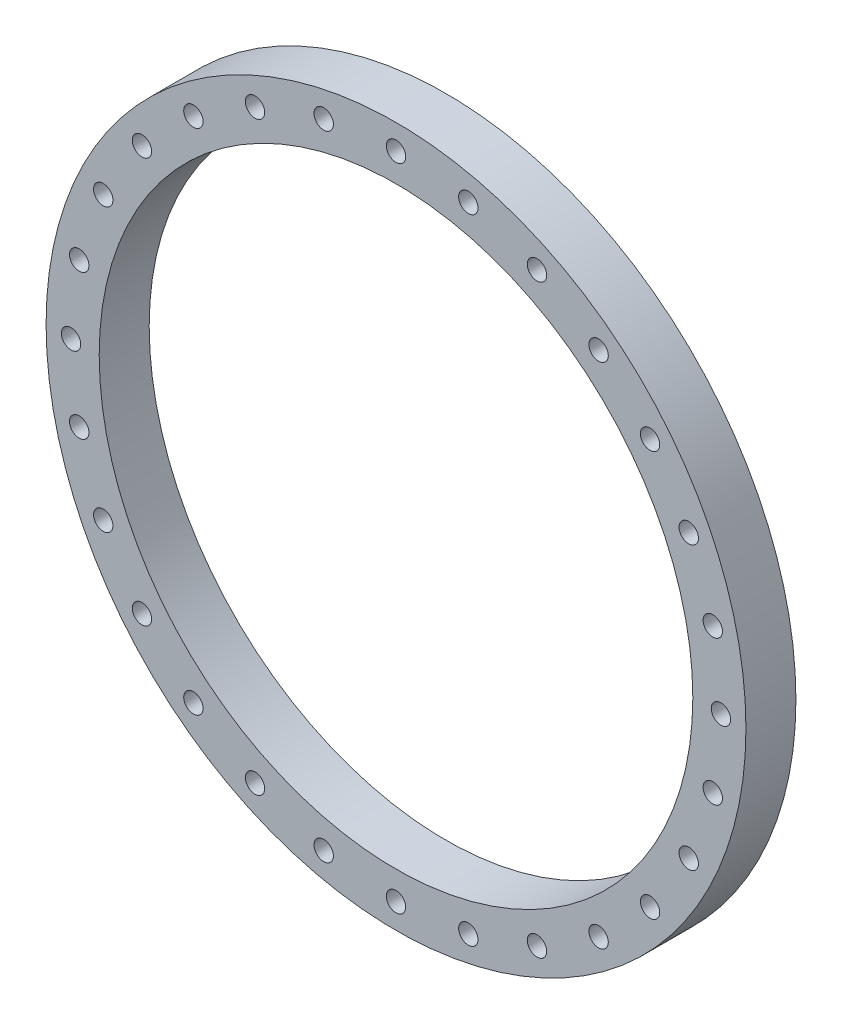
ISO-10303-21;
HEADER;
FILE_DESCRIPTION(('STEP AP214'),'2;1');
FILE_NAME('part.step','',(''),(''),'','','');
FILE_SCHEMA(('AUTOMOTIVE_DESIGN { 1 0 10303 214 1 1 1 1 }'));
ENDSEC;
DATA;
#1=APPLICATION_CONTEXT('core data for automotive mechanical design processes');
#2=APPLICATION_PROTOCOL_DEFINITION('international standard','automotive_design',2000,#1);
#3=PRODUCT_CONTEXT('',#1,'mechanical');
#4=PRODUCT('Part','Part','',(#3));
#5=PRODUCT_RELATED_PRODUCT_CATEGORY('part','',(#4));
#6=PRODUCT_DEFINITION_FORMATION('','',#4);
#7=PRODUCT_DEFINITION_CONTEXT('part definition',#1,'design');
#8=PRODUCT_DEFINITION('design','',#6,#7);
#9=PRODUCT_DEFINITION_SHAPE('','',#8);
#10=(LENGTH_UNIT() NAMED_UNIT(*) SI_UNIT(.MILLI.,.METRE.));
#11=(NAMED_UNIT(*) PLANE_ANGLE_UNIT() SI_UNIT($,.RADIAN.));
#12=(NAMED_UNIT(*) SI_UNIT($,.STERADIAN.) SOLID_ANGLE_UNIT());
#13=UNCERTAINTY_MEASURE_WITH_UNIT(LENGTH_MEASURE(1.E-05),#10,'distance_accuracy_value','');
#14=(GEOMETRIC_REPRESENTATION_CONTEXT(3) GLOBAL_UNCERTAINTY_ASSIGNED_CONTEXT((#13)) GLOBAL_UNIT_ASSIGNED_CONTEXT((#10,
#11,#12)) REPRESENTATION_CONTEXT('',''));
#15=CARTESIAN_POINT('',(0.,0.,0.));
#16=DIRECTION('',(0.,0.,1.));
#17=DIRECTION('',(1.,0.,0.));
#18=AXIS2_PLACEMENT_3D('',#15,#16,#17);
#19=CARTESIAN_POINT('',(0.,0.,8.));
#20=DIRECTION('',(0.,0.,1.));
#21=DIRECTION('',(1.,0.,0.));
#22=AXIS2_PLACEMENT_3D('',#19,#20,#21);
#23=PLANE('',#22);
#24=CARTESIAN_POINT('',(-22.561954434113,46.8503811309258,8.));
#25=DIRECTION('',(0.,0.,1.));
#26=DIRECTION('',(1.,0.,0.));
#27=AXIS2_PLACEMENT_3D('',#24,#25,#26);
#28=CIRCLE('',#27,1.55);
#29=CARTESIAN_POINT('',(-21.011954434113,46.8503811309258,8.));
#30=VERTEX_POINT('',#29);
#31=EDGE_CURVE('E264',#30,#30,#28,.T.);
#32=ORIENTED_EDGE('',*,*,#31,.F.);
#33=EDGE_LOOP('',(#32));
#34=FACE_BOUND('',#33,.T.);
#35=CARTESIAN_POINT('',(-40.6552370883376,32.4214696966541,8.));
#36=DIRECTION('',(0.,0.,1.));
#37=DIRECTION('',(1.,0.,0.));
#38=AXIS2_PLACEMENT_3D('',#35,#36,#37);
#39=CIRCLE('',#38,1.55);
#40=CARTESIAN_POINT('',(-39.1052370883376,32.4214696966541,8.));
#41=VERTEX_POINT('',#40);
#42=EDGE_CURVE('E248',#41,#41,#39,.T.);
#43=ORIENTED_EDGE('',*,*,#42,.F.);
#44=EDGE_LOOP('',(#43));
#45=FACE_BOUND('',#44,.T.);
#46=CARTESIAN_POINT('',(-50.6962514334548,11.5710885657283,8.));
#47=DIRECTION('',(0.,0.,1.));
#48=DIRECTION('',(1.,0.,0.));
#49=AXIS2_PLACEMENT_3D('',#46,#47,#48);
#50=CIRCLE('',#49,1.55);
#51=CARTESIAN_POINT('',(-49.1462514334548,11.5710885657283,8.));
#52=VERTEX_POINT('',#51);
#53=EDGE_CURVE('E232',#52,#52,#50,.T.);
#54=ORIENTED_EDGE('',*,*,#53,.F.);
#55=EDGE_LOOP('',(#54));
#56=FACE_BOUND('',#55,.T.);
#57=CARTESIAN_POINT('',(-50.6962514334548,-11.5710885657284,8.));
#58=DIRECTION('',(0.,0.,1.));
#59=DIRECTION('',(1.,0.,0.));
#60=AXIS2_PLACEMENT_3D('',#57,#58,#59);
#61=CIRCLE('',#60,1.55);
#62=CARTESIAN_POINT('',(-49.1462514334548,-11.5710885657284,8.));
#63=VERTEX_POINT('',#62);
#64=EDGE_CURVE('E216',#63,#63,#61,.T.);
#65=ORIENTED_EDGE('',*,*,#64,.F.);
#66=EDGE_LOOP('',(#65));
#67=FACE_BOUND('',#66,.T.);
#68=CARTESIAN_POINT('',(-40.6552370883375,-32.4214696966541,8.));
#69=DIRECTION('',(0.,0.,1.));
#70=DIRECTION('',(1.,0.,0.));
#71=AXIS2_PLACEMENT_3D('',#68,#69,#70);
#72=CIRCLE('',#71,1.54999999999999);
#73=CARTESIAN_POINT('',(-39.1052370883375,-32.4214696966541,8.));
#74=VERTEX_POINT('',#73);
#75=EDGE_CURVE('E200',#74,#74,#72,.T.);
#76=ORIENTED_EDGE('',*,*,#75,.F.);
#77=EDGE_LOOP('',(#76));
#78=FACE_BOUND('',#77,.T.);
#79=CARTESIAN_POINT('',(-22.561954434113,-46.8503811309258,8.));
#80=DIRECTION('',(0.,0.,1.));
#81=DIRECTION('',(1.,0.,0.));
#82=AXIS2_PLACEMENT_3D('',#79,#80,#81);
#83=CIRCLE('',#82,1.55);
#84=CARTESIAN_POINT('',(-21.011954434113,-46.8503811309258,8.));
#85=VERTEX_POINT('',#84);
#86=EDGE_CURVE('E184',#85,#85,#83,.T.);
#87=ORIENTED_EDGE('',*,*,#86,.F.);
#88=EDGE_LOOP('',(#87));
#89=FACE_BOUND('',#88,.T.);
#90=CARTESIAN_POINT('',(0.,-52.,8.));
#91=DIRECTION('',(0.,0.,1.));
#92=DIRECTION('',(1.,0.,0.));
#93=AXIS2_PLACEMENT_3D('',#90,#91,#92);
#94=CIRCLE('',#93,1.55);
#95=CARTESIAN_POINT('',(1.55000000000001,-52.,8.));
#96=VERTEX_POINT('',#95);
#97=EDGE_CURVE('E168',#96,#96,#94,.T.);
#98=ORIENTED_EDGE('',*,*,#97,.F.);
#99=EDGE_LOOP('',(#98));
#100=FACE_BOUND('',#99,.T.);
#101=CARTESIAN_POINT('',(22.561954434113,-46.8503811309258,8.));
#102=DIRECTION('',(0.,0.,1.));
#103=DIRECTION('',(1.,0.,0.));
#104=AXIS2_PLACEMENT_3D('',#101,#102,#103);
#105=CIRCLE('',#104,1.54999999999999);
#106=CARTESIAN_POINT('',(24.111954434113,-46.8503811309258,8.));
#107=VERTEX_POINT('',#106);
#108=EDGE_CURVE('E152',#107,#107,#105,.T.);
#109=ORIENTED_EDGE('',*,*,#108,.F.);
#110=EDGE_LOOP('',(#109));
#111=FACE_BOUND('',#110,.T.);
#112=CARTESIAN_POINT('',(40.6552370883376,-32.4214696966541,8.));
#113=DIRECTION('',(0.,0.,1.));
#114=DIRECTION('',(1.,0.,0.));
#115=AXIS2_PLACEMENT_3D('',#112,#113,#114);
#116=CIRCLE('',#115,1.55);
#117=CARTESIAN_POINT('',(42.2052370883376,-32.4214696966541,8.));
#118=VERTEX_POINT('',#117);
#119=EDGE_CURVE('E136',#118,#118,#116,.T.);
#120=ORIENTED_EDGE('',*,*,#119,.F.);
#121=EDGE_LOOP('',(#120));
#122=FACE_BOUND('',#121,.T.);
#123=CARTESIAN_POINT('',(50.6962514334548,-11.5710885657283,8.));
#124=DIRECTION('',(0.,0.,1.));
#125=DIRECTION('',(1.,0.,0.));
#126=AXIS2_PLACEMENT_3D('',#123,#124,#125);
#127=CIRCLE('',#126,1.54999999999999);
#128=CARTESIAN_POINT('',(52.2462514334548,-11.5710885657283,8.));
#129=VERTEX_POINT('',#128);
#130=EDGE_CURVE('E120',#129,#129,#127,.T.);
#131=ORIENTED_EDGE('',*,*,#130,.F.);
#132=EDGE_LOOP('',(#131));
#133=FACE_BOUND('',#132,.T.);
#134=CARTESIAN_POINT('',(50.6962514334548,11.5710885657283,8.));
#135=DIRECTION('',(0.,0.,1.));
#136=DIRECTION('',(1.,0.,0.));
#137=AXIS2_PLACEMENT_3D('',#134,#135,#136);
#138=CIRCLE('',#137,1.55);
#139=CARTESIAN_POINT('',(52.2462514334548,11.5710885657283,8.));
#140=VERTEX_POINT('',#139);
#141=EDGE_CURVE('E104',#140,#140,#138,.T.);
#142=ORIENTED_EDGE('',*,*,#141,.F.);
#143=EDGE_LOOP('',(#142));
#144=FACE_BOUND('',#143,.T.);
#145=CARTESIAN_POINT('',(40.6552370883376,32.4214696966541,8.));
#146=DIRECTION('',(0.,0.,1.));
#147=DIRECTION('',(1.,0.,0.));
#148=AXIS2_PLACEMENT_3D('',#145,#146,#147);
#149=CIRCLE('',#148,1.54999999999999);
#150=CARTESIAN_POINT('',(42.2052370883375,32.4214696966541,8.));
#151=VERTEX_POINT('',#150);
#152=EDGE_CURVE('E88',#151,#151,#149,.T.);
#153=ORIENTED_EDGE('',*,*,#152,.F.);
#154=EDGE_LOOP('',(#153));
#155=FACE_BOUND('',#154,.T.);
#156=CARTESIAN_POINT('',(22.561954434113,46.8503811309258,8.));
#157=DIRECTION('',(0.,0.,1.));
#158=DIRECTION('',(1.,0.,0.));
#159=AXIS2_PLACEMENT_3D('',#156,#157,#158);
#160=CIRCLE('',#159,1.55);
#161=CARTESIAN_POINT('',(24.111954434113,46.8503811309258,8.));
#162=VERTEX_POINT('',#161);
#163=EDGE_CURVE('E72',#162,#162,#160,.T.);
#164=ORIENTED_EDGE('',*,*,#163,.F.);
#165=EDGE_LOOP('',(#164));
#166=FACE_BOUND('',#165,.T.);
#167=CARTESIAN_POINT('',(0.,52.,8.));
#168=DIRECTION('',(0.,0.,1.));
#169=DIRECTION('',(1.,0.,0.));
#170=AXIS2_PLACEMENT_3D('',#167,#168,#169);
#171=CIRCLE('',#170,1.55);
#172=CARTESIAN_POINT('',(1.55,52.,8.));
#173=VERTEX_POINT('',#172);
#174=EDGE_CURVE('E56',#173,#173,#171,.T.);
#175=ORIENTED_EDGE('',*,*,#174,.F.);
#176=EDGE_LOOP('',(#175));
#177=FACE_BOUND('',#176,.T.);
#178=CARTESIAN_POINT('',(0.,0.,8.));
#179=DIRECTION('',(0.,0.,1.));
#180=DIRECTION('',(1.,0.,0.));
#181=AXIS2_PLACEMENT_3D('',#178,#179,#180);
#182=CIRCLE('',#181,56.);
#183=CARTESIAN_POINT('',(56.,0.,8.));
#184=VERTEX_POINT('',#183);
#185=EDGE_CURVE('E10',#184,#184,#182,.T.);
#186=ORIENTED_EDGE('',*,*,#185,.T.);
#187=EDGE_LOOP('',(#186));
#188=FACE_BOUND('',#187,.T.);
#189=CARTESIAN_POINT('',(0.,0.,8.));
#190=DIRECTION('',(0.,0.,1.));
#191=DIRECTION('',(1.,0.,0.));
#192=AXIS2_PLACEMENT_3D('',#189,#190,#191);
#193=CIRCLE('',#192,47.5);
#194=CARTESIAN_POINT('',(47.5,0.,8.));
#195=VERTEX_POINT('',#194);
#196=EDGE_CURVE('E50',#195,#195,#193,.T.);
#197=ORIENTED_EDGE('',*,*,#196,.F.);
#198=EDGE_LOOP('',(#197));
#199=FACE_BOUND('',#198,.T.);
#200=CARTESIAN_POINT('',(11.5710885657283,50.6962514334548,8.));
#201=DIRECTION('',(0.,0.,1.));
#202=DIRECTION('',(1.,0.,0.));
#203=AXIS2_PLACEMENT_3D('',#200,#201,#202);
#204=CIRCLE('',#203,1.55);
#205=CARTESIAN_POINT('',(13.1210885657283,50.6962514334548,8.));
#206=VERTEX_POINT('',#205);
#207=EDGE_CURVE('E64',#206,#206,#204,.T.);
#208=ORIENTED_EDGE('',*,*,#207,.F.);
#209=EDGE_LOOP('',(#208));
#210=FACE_BOUND('',#209,.T.);
#211=CARTESIAN_POINT('',(32.4214696966541,40.6552370883376,8.));
#212=DIRECTION('',(0.,0.,1.));
#213=DIRECTION('',(1.,0.,0.));
#214=AXIS2_PLACEMENT_3D('',#211,#212,#213);
#215=CIRCLE('',#214,1.54999999999999);
#216=CARTESIAN_POINT('',(33.9714696966541,40.6552370883376,8.));
#217=VERTEX_POINT('',#216);
#218=EDGE_CURVE('E80',#217,#217,#215,.T.);
#219=ORIENTED_EDGE('',*,*,#218,.F.);
#220=EDGE_LOOP('',(#219));
#221=FACE_BOUND('',#220,.T.);
#222=CARTESIAN_POINT('',(46.8503811309258,22.561954434113,8.));
#223=DIRECTION('',(0.,0.,1.));
#224=DIRECTION('',(1.,0.,0.));
#225=AXIS2_PLACEMENT_3D('',#222,#223,#224);
#226=CIRCLE('',#225,1.55);
#227=CARTESIAN_POINT('',(48.4003811309258,22.561954434113,8.));
#228=VERTEX_POINT('',#227);
#229=EDGE_CURVE('E96',#228,#228,#226,.T.);
#230=ORIENTED_EDGE('',*,*,#229,.F.);
#231=EDGE_LOOP('',(#230));
#232=FACE_BOUND('',#231,.T.);
#233=CARTESIAN_POINT('',(52.,0.,8.));
#234=DIRECTION('',(0.,0.,1.));
#235=DIRECTION('',(1.,0.,0.));
#236=AXIS2_PLACEMENT_3D('',#233,#234,#235);
#237=CIRCLE('',#236,1.54999999999999);
#238=CARTESIAN_POINT('',(53.55,0.,8.));
#239=VERTEX_POINT('',#238);
#240=EDGE_CURVE('E112',#239,#239,#237,.T.);
#241=ORIENTED_EDGE('',*,*,#240,.F.);
#242=EDGE_LOOP('',(#241));
#243=FACE_BOUND('',#242,.T.);
#244=CARTESIAN_POINT('',(46.8503811309258,-22.561954434113,8.));
#245=DIRECTION('',(0.,0.,1.));
#246=DIRECTION('',(1.,0.,0.));
#247=AXIS2_PLACEMENT_3D('',#244,#245,#246);
#248=CIRCLE('',#247,1.54999999999999);
#249=CARTESIAN_POINT('',(48.4003811309258,-22.561954434113,8.));
#250=VERTEX_POINT('',#249);
#251=EDGE_CURVE('E128',#250,#250,#248,.T.);
#252=ORIENTED_EDGE('',*,*,#251,.F.);
#253=EDGE_LOOP('',(#252));
#254=FACE_BOUND('',#253,.T.);
#255=CARTESIAN_POINT('',(32.4214696966541,-40.6552370883375,8.));
#256=DIRECTION('',(0.,0.,1.));
#257=DIRECTION('',(1.,0.,0.));
#258=AXIS2_PLACEMENT_3D('',#255,#256,#257);
#259=CIRCLE('',#258,1.54999999999999);
#260=CARTESIAN_POINT('',(33.9714696966541,-40.6552370883375,8.));
#261=VERTEX_POINT('',#260);
#262=EDGE_CURVE('E144',#261,#261,#259,.T.);
#263=ORIENTED_EDGE('',*,*,#262,.F.);
#264=EDGE_LOOP('',(#263));
#265=FACE_BOUND('',#264,.T.);
#266=CARTESIAN_POINT('',(11.5710885657284,-50.6962514334548,8.));
#267=DIRECTION('',(0.,0.,1.));
#268=DIRECTION('',(1.,0.,0.));
#269=AXIS2_PLACEMENT_3D('',#266,#267,#268);
#270=CIRCLE('',#269,1.55);
#271=CARTESIAN_POINT('',(13.1210885657284,-50.6962514334548,8.));
#272=VERTEX_POINT('',#271);
#273=EDGE_CURVE('E160',#272,#272,#270,.T.);
#274=ORIENTED_EDGE('',*,*,#273,.F.);
#275=EDGE_LOOP('',(#274));
#276=FACE_BOUND('',#275,.T.);
#277=CARTESIAN_POINT('',(-11.5710885657283,-50.6962514334548,8.));
#278=DIRECTION('',(0.,0.,1.));
#279=DIRECTION('',(1.,0.,0.));
#280=AXIS2_PLACEMENT_3D('',#277,#278,#279);
#281=CIRCLE('',#280,1.55);
#282=CARTESIAN_POINT('',(-10.0210885657283,-50.6962514334548,8.));
#283=VERTEX_POINT('',#282);
#284=EDGE_CURVE('E176',#283,#283,#281,.T.);
#285=ORIENTED_EDGE('',*,*,#284,.F.);
#286=EDGE_LOOP('',(#285));
#287=FACE_BOUND('',#286,.T.);
#288=CARTESIAN_POINT('',(-32.4214696966541,-40.6552370883376,8.));
#289=DIRECTION('',(0.,0.,1.));
#290=DIRECTION('',(1.,0.,0.));
#291=AXIS2_PLACEMENT_3D('',#288,#289,#290);
#292=CIRCLE('',#291,1.55);
#293=CARTESIAN_POINT('',(-30.8714696966541,-40.6552370883376,8.));
#294=VERTEX_POINT('',#293);
#295=EDGE_CURVE('E192',#294,#294,#292,.T.);
#296=ORIENTED_EDGE('',*,*,#295,.F.);
#297=EDGE_LOOP('',(#296));
#298=FACE_BOUND('',#297,.T.);
#299=CARTESIAN_POINT('',(-46.8503811309258,-22.561954434113,8.));
#300=DIRECTION('',(0.,0.,1.));
#301=DIRECTION('',(1.,0.,0.));
#302=AXIS2_PLACEMENT_3D('',#299,#300,#301);
#303=CIRCLE('',#302,1.55);
#304=CARTESIAN_POINT('',(-45.3003811309258,-22.561954434113,8.));
#305=VERTEX_POINT('',#304);
#306=EDGE_CURVE('E208',#305,#305,#303,.T.);
#307=ORIENTED_EDGE('',*,*,#306,.F.);
#308=EDGE_LOOP('',(#307));
#309=FACE_BOUND('',#308,.T.);
#310=CARTESIAN_POINT('',(-52.,0.,8.));
#311=DIRECTION('',(0.,0.,1.));
#312=DIRECTION('',(1.,0.,0.));
#313=AXIS2_PLACEMENT_3D('',#310,#311,#312);
#314=CIRCLE('',#313,1.55);
#315=CARTESIAN_POINT('',(-50.45,0.,8.));
#316=VERTEX_POINT('',#315);
#317=EDGE_CURVE('E224',#316,#316,#314,.T.);
#318=ORIENTED_EDGE('',*,*,#317,.F.);
#319=EDGE_LOOP('',(#318));
#320=FACE_BOUND('',#319,.T.);
#321=CARTESIAN_POINT('',(-46.8503811309258,22.561954434113,8.));
#322=DIRECTION('',(0.,0.,1.));
#323=DIRECTION('',(1.,0.,0.));
#324=AXIS2_PLACEMENT_3D('',#321,#322,#323);
#325=CIRCLE('',#324,1.55);
#326=CARTESIAN_POINT('',(-45.3003811309258,22.561954434113,8.));
#327=VERTEX_POINT('',#326);
#328=EDGE_CURVE('E240',#327,#327,#325,.T.);
#329=ORIENTED_EDGE('',*,*,#328,.F.);
#330=EDGE_LOOP('',(#329));
#331=FACE_BOUND('',#330,.T.);
#332=CARTESIAN_POINT('',(-32.4214696966541,40.6552370883375,8.));
#333=DIRECTION('',(0.,0.,1.));
#334=DIRECTION('',(1.,0.,0.));
#335=AXIS2_PLACEMENT_3D('',#332,#333,#334);
#336=CIRCLE('',#335,1.55);
#337=CARTESIAN_POINT('',(-30.8714696966541,40.6552370883375,8.));
#338=VERTEX_POINT('',#337);
#339=EDGE_CURVE('E256',#338,#338,#336,.T.);
#340=ORIENTED_EDGE('',*,*,#339,.F.);
#341=EDGE_LOOP('',(#340));
#342=FACE_BOUND('',#341,.T.);
#343=CARTESIAN_POINT('',(-11.5710885657284,50.6962514334548,8.));
#344=DIRECTION('',(0.,0.,1.));
#345=DIRECTION('',(1.,0.,0.));
#346=AXIS2_PLACEMENT_3D('',#343,#344,#345);
#347=CIRCLE('',#346,1.55);
#348=CARTESIAN_POINT('',(-10.0210885657284,50.6962514334548,8.));
#349=VERTEX_POINT('',#348);
#350=EDGE_CURVE('E272',#349,#349,#347,.T.);
#351=ORIENTED_EDGE('',*,*,#350,.F.);
#352=EDGE_LOOP('',(#351));
#353=FACE_BOUND('',#352,.T.);
#354=ADVANCED_FACE('F37',(#34,#45,#56,#67,#78,#89,#100,#111,#122,#133,#144,#155,#166,#177,#188,
#199,#210,#221,#232,#243,#254,#265,#276,#287,#298,#309,#320,#331,#342,#353),#23,.T.);
#355=CARTESIAN_POINT('',(0.,0.,0.));
#356=DIRECTION('',(0.,0.,1.));
#357=DIRECTION('',(1.,0.,0.));
#358=AXIS2_PLACEMENT_3D('',#355,#356,#357);
#359=PLANE('',#358);
#360=CARTESIAN_POINT('',(0.,0.,0.));
#361=DIRECTION('',(0.,0.,1.));
#362=DIRECTION('',(1.,0.,0.));
#363=AXIS2_PLACEMENT_3D('',#360,#361,#362);
#364=CIRCLE('',#363,56.);
#365=CARTESIAN_POINT('',(56.,0.,0.));
#366=VERTEX_POINT('',#365);
#367=EDGE_CURVE('E41',#366,#366,#364,.T.);
#368=ORIENTED_EDGE('',*,*,#367,.F.);
#369=EDGE_LOOP('',(#368));
#370=FACE_BOUND('',#369,.T.);
#371=CARTESIAN_POINT('',(0.,0.,0.));
#372=DIRECTION('',(0.,0.,1.));
#373=DIRECTION('',(1.,0.,0.));
#374=AXIS2_PLACEMENT_3D('',#371,#372,#373);
#375=CIRCLE('',#374,47.5);
#376=CARTESIAN_POINT('',(47.5,0.,0.));
#377=VERTEX_POINT('',#376);
#378=EDGE_CURVE('E52',#377,#377,#375,.T.);
#379=ORIENTED_EDGE('',*,*,#378,.T.);
#380=EDGE_LOOP('',(#379));
#381=FACE_BOUND('',#380,.T.);
#382=CARTESIAN_POINT('',(0.,52.,0.));
#383=DIRECTION('',(0.,0.,1.));
#384=DIRECTION('',(1.,0.,0.));
#385=AXIS2_PLACEMENT_3D('',#382,#383,#384);
#386=CIRCLE('',#385,1.55);
#387=CARTESIAN_POINT('',(1.55,52.,0.));
#388=VERTEX_POINT('',#387);
#389=EDGE_CURVE('E60',#388,#388,#386,.T.);
#390=ORIENTED_EDGE('',*,*,#389,.T.);
#391=EDGE_LOOP('',(#390));
#392=FACE_BOUND('',#391,.T.);
#393=CARTESIAN_POINT('',(11.5710885657283,50.6962514334548,0.));
#394=DIRECTION('',(0.,0.,1.));
#395=DIRECTION('',(1.,0.,0.));
#396=AXIS2_PLACEMENT_3D('',#393,#394,#395);
#397=CIRCLE('',#396,1.55);
#398=CARTESIAN_POINT('',(13.1210885657283,50.6962514334548,0.));
#399=VERTEX_POINT('',#398);
#400=EDGE_CURVE('E68',#399,#399,#397,.T.);
#401=ORIENTED_EDGE('',*,*,#400,.T.);
#402=EDGE_LOOP('',(#401));
#403=FACE_BOUND('',#402,.T.);
#404=CARTESIAN_POINT('',(22.561954434113,46.8503811309258,0.));
#405=DIRECTION('',(0.,0.,1.));
#406=DIRECTION('',(1.,0.,0.));
#407=AXIS2_PLACEMENT_3D('',#404,#405,#406);
#408=CIRCLE('',#407,1.55);
#409=CARTESIAN_POINT('',(24.111954434113,46.8503811309258,0.));
#410=VERTEX_POINT('',#409);
#411=EDGE_CURVE('E76',#410,#410,#408,.T.);
#412=ORIENTED_EDGE('',*,*,#411,.T.);
#413=EDGE_LOOP('',(#412));
#414=FACE_BOUND('',#413,.T.);
#415=CARTESIAN_POINT('',(32.4214696966541,40.6552370883376,0.));
#416=DIRECTION('',(0.,0.,1.));
#417=DIRECTION('',(1.,0.,0.));
#418=AXIS2_PLACEMENT_3D('',#415,#416,#417);
#419=CIRCLE('',#418,1.54999999999999);
#420=CARTESIAN_POINT('',(33.9714696966541,40.6552370883376,0.));
#421=VERTEX_POINT('',#420);
#422=EDGE_CURVE('E84',#421,#421,#419,.T.);
#423=ORIENTED_EDGE('',*,*,#422,.T.);
#424=EDGE_LOOP('',(#423));
#425=FACE_BOUND('',#424,.T.);
#426=CARTESIAN_POINT('',(40.6552370883376,32.4214696966541,0.));
#427=DIRECTION('',(0.,0.,1.));
#428=DIRECTION('',(1.,0.,0.));
#429=AXIS2_PLACEMENT_3D('',#426,#427,#428);
#430=CIRCLE('',#429,1.54999999999999);
#431=CARTESIAN_POINT('',(42.2052370883375,32.4214696966541,0.));
#432=VERTEX_POINT('',#431);
#433=EDGE_CURVE('E92',#432,#432,#430,.T.);
#434=ORIENTED_EDGE('',*,*,#433,.T.);
#435=EDGE_LOOP('',(#434));
#436=FACE_BOUND('',#435,.T.);
#437=CARTESIAN_POINT('',(46.8503811309258,22.561954434113,0.));
#438=DIRECTION('',(0.,0.,1.));
#439=DIRECTION('',(1.,0.,0.));
#440=AXIS2_PLACEMENT_3D('',#437,#438,#439);
#441=CIRCLE('',#440,1.55);
#442=CARTESIAN_POINT('',(48.4003811309258,22.561954434113,0.));
#443=VERTEX_POINT('',#442);
#444=EDGE_CURVE('E100',#443,#443,#441,.T.);
#445=ORIENTED_EDGE('',*,*,#444,.T.);
#446=EDGE_LOOP('',(#445));
#447=FACE_BOUND('',#446,.T.);
#448=CARTESIAN_POINT('',(50.6962514334548,11.5710885657283,0.));
#449=DIRECTION('',(0.,0.,1.));
#450=DIRECTION('',(1.,0.,0.));
#451=AXIS2_PLACEMENT_3D('',#448,#449,#450);
#452=CIRCLE('',#451,1.55);
#453=CARTESIAN_POINT('',(52.2462514334548,11.5710885657283,0.));
#454=VERTEX_POINT('',#453);
#455=EDGE_CURVE('E108',#454,#454,#452,.T.);
#456=ORIENTED_EDGE('',*,*,#455,.T.);
#457=EDGE_LOOP('',(#456));
#458=FACE_BOUND('',#457,.T.);
#459=CARTESIAN_POINT('',(52.,0.,0.));
#460=DIRECTION('',(0.,0.,1.));
#461=DIRECTION('',(1.,0.,0.));
#462=AXIS2_PLACEMENT_3D('',#459,#460,#461);
#463=CIRCLE('',#462,1.54999999999999);
#464=CARTESIAN_POINT('',(53.55,0.,0.));
#465=VERTEX_POINT('',#464);
#466=EDGE_CURVE('E116',#465,#465,#463,.T.);
#467=ORIENTED_EDGE('',*,*,#466,.T.);
#468=EDGE_LOOP('',(#467));
#469=FACE_BOUND('',#468,.T.);
#470=CARTESIAN_POINT('',(50.6962514334548,-11.5710885657283,0.));
#471=DIRECTION('',(0.,0.,1.));
#472=DIRECTION('',(1.,0.,0.));
#473=AXIS2_PLACEMENT_3D('',#470,#471,#472);
#474=CIRCLE('',#473,1.54999999999999);
#475=CARTESIAN_POINT('',(52.2462514334548,-11.5710885657283,0.));
#476=VERTEX_POINT('',#475);
#477=EDGE_CURVE('E124',#476,#476,#474,.T.);
#478=ORIENTED_EDGE('',*,*,#477,.T.);
#479=EDGE_LOOP('',(#478));
#480=FACE_BOUND('',#479,.T.);
#481=CARTESIAN_POINT('',(46.8503811309258,-22.561954434113,0.));
#482=DIRECTION('',(0.,0.,1.));
#483=DIRECTION('',(1.,0.,0.));
#484=AXIS2_PLACEMENT_3D('',#481,#482,#483);
#485=CIRCLE('',#484,1.54999999999999);
#486=CARTESIAN_POINT('',(48.4003811309258,-22.561954434113,0.));
#487=VERTEX_POINT('',#486);
#488=EDGE_CURVE('E132',#487,#487,#485,.T.);
#489=ORIENTED_EDGE('',*,*,#488,.T.);
#490=EDGE_LOOP('',(#489));
#491=FACE_BOUND('',#490,.T.);
#492=CARTESIAN_POINT('',(40.6552370883376,-32.4214696966541,0.));
#493=DIRECTION('',(0.,0.,1.));
#494=DIRECTION('',(1.,0.,0.));
#495=AXIS2_PLACEMENT_3D('',#492,#493,#494);
#496=CIRCLE('',#495,1.55);
#497=CARTESIAN_POINT('',(42.2052370883376,-32.4214696966541,0.));
#498=VERTEX_POINT('',#497);
#499=EDGE_CURVE('E140',#498,#498,#496,.T.);
#500=ORIENTED_EDGE('',*,*,#499,.T.);
#501=EDGE_LOOP('',(#500));
#502=FACE_BOUND('',#501,.T.);
#503=CARTESIAN_POINT('',(32.4214696966541,-40.6552370883375,0.));
#504=DIRECTION('',(0.,0.,1.));
#505=DIRECTION('',(1.,0.,0.));
#506=AXIS2_PLACEMENT_3D('',#503,#504,#505);
#507=CIRCLE('',#506,1.54999999999999);
#508=CARTESIAN_POINT('',(33.9714696966541,-40.6552370883375,0.));
#509=VERTEX_POINT('',#508);
#510=EDGE_CURVE('E148',#509,#509,#507,.T.);
#511=ORIENTED_EDGE('',*,*,#510,.T.);
#512=EDGE_LOOP('',(#511));
#513=FACE_BOUND('',#512,.T.);
#514=CARTESIAN_POINT('',(22.561954434113,-46.8503811309258,0.));
#515=DIRECTION('',(0.,0.,1.));
#516=DIRECTION('',(1.,0.,0.));
#517=AXIS2_PLACEMENT_3D('',#514,#515,#516);
#518=CIRCLE('',#517,1.54999999999999);
#519=CARTESIAN_POINT('',(24.111954434113,-46.8503811309258,0.));
#520=VERTEX_POINT('',#519);
#521=EDGE_CURVE('E156',#520,#520,#518,.T.);
#522=ORIENTED_EDGE('',*,*,#521,.T.);
#523=EDGE_LOOP('',(#522));
#524=FACE_BOUND('',#523,.T.);
#525=CARTESIAN_POINT('',(11.5710885657284,-50.6962514334548,0.));
#526=DIRECTION('',(0.,0.,1.));
#527=DIRECTION('',(1.,0.,0.));
#528=AXIS2_PLACEMENT_3D('',#525,#526,#527);
#529=CIRCLE('',#528,1.55);
#530=CARTESIAN_POINT('',(13.1210885657284,-50.6962514334548,0.));
#531=VERTEX_POINT('',#530);
#532=EDGE_CURVE('E164',#531,#531,#529,.T.);
#533=ORIENTED_EDGE('',*,*,#532,.T.);
#534=EDGE_LOOP('',(#533));
#535=FACE_BOUND('',#534,.T.);
#536=CARTESIAN_POINT('',(0.,-52.,0.));
#537=DIRECTION('',(0.,0.,1.));
#538=DIRECTION('',(1.,0.,0.));
#539=AXIS2_PLACEMENT_3D('',#536,#537,#538);
#540=CIRCLE('',#539,1.55);
#541=CARTESIAN_POINT('',(1.55000000000001,-52.,0.));
#542=VERTEX_POINT('',#541);
#543=EDGE_CURVE('E172',#542,#542,#540,.T.);
#544=ORIENTED_EDGE('',*,*,#543,.T.);
#545=EDGE_LOOP('',(#544));
#546=FACE_BOUND('',#545,.T.);
#547=CARTESIAN_POINT('',(-11.5710885657283,-50.6962514334548,0.));
#548=DIRECTION('',(0.,0.,1.));
#549=DIRECTION('',(1.,0.,0.));
#550=AXIS2_PLACEMENT_3D('',#547,#548,#549);
#551=CIRCLE('',#550,1.55);
#552=CARTESIAN_POINT('',(-10.0210885657283,-50.6962514334548,0.));
#553=VERTEX_POINT('',#552);
#554=EDGE_CURVE('E180',#553,#553,#551,.T.);
#555=ORIENTED_EDGE('',*,*,#554,.T.);
#556=EDGE_LOOP('',(#555));
#557=FACE_BOUND('',#556,.T.);
#558=CARTESIAN_POINT('',(-22.561954434113,-46.8503811309258,0.));
#559=DIRECTION('',(0.,0.,1.));
#560=DIRECTION('',(1.,0.,0.));
#561=AXIS2_PLACEMENT_3D('',#558,#559,#560);
#562=CIRCLE('',#561,1.55);
#563=CARTESIAN_POINT('',(-21.011954434113,-46.8503811309258,0.));
#564=VERTEX_POINT('',#563);
#565=EDGE_CURVE('E188',#564,#564,#562,.T.);
#566=ORIENTED_EDGE('',*,*,#565,.T.);
#567=EDGE_LOOP('',(#566));
#568=FACE_BOUND('',#567,.T.);
#569=CARTESIAN_POINT('',(-32.4214696966541,-40.6552370883376,0.));
#570=DIRECTION('',(0.,0.,1.));
#571=DIRECTION('',(1.,0.,0.));
#572=AXIS2_PLACEMENT_3D('',#569,#570,#571);
#573=CIRCLE('',#572,1.55);
#574=CARTESIAN_POINT('',(-30.8714696966541,-40.6552370883376,0.));
#575=VERTEX_POINT('',#574);
#576=EDGE_CURVE('E196',#575,#575,#573,.T.);
#577=ORIENTED_EDGE('',*,*,#576,.T.);
#578=EDGE_LOOP('',(#577));
#579=FACE_BOUND('',#578,.T.);
#580=CARTESIAN_POINT('',(-40.6552370883375,-32.4214696966541,0.));
#581=DIRECTION('',(0.,0.,1.));
#582=DIRECTION('',(1.,0.,0.));
#583=AXIS2_PLACEMENT_3D('',#580,#581,#582);
#584=CIRCLE('',#583,1.54999999999999);
#585=CARTESIAN_POINT('',(-39.1052370883375,-32.4214696966541,0.));
#586=VERTEX_POINT('',#585);
#587=EDGE_CURVE('E204',#586,#586,#584,.T.);
#588=ORIENTED_EDGE('',*,*,#587,.T.);
#589=EDGE_LOOP('',(#588));
#590=FACE_BOUND('',#589,.T.);
#591=CARTESIAN_POINT('',(-46.8503811309258,-22.561954434113,0.));
#592=DIRECTION('',(0.,0.,1.));
#593=DIRECTION('',(1.,0.,0.));
#594=AXIS2_PLACEMENT_3D('',#591,#592,#593);
#595=CIRCLE('',#594,1.55);
#596=CARTESIAN_POINT('',(-45.3003811309258,-22.561954434113,0.));
#597=VERTEX_POINT('',#596);
#598=EDGE_CURVE('E212',#597,#597,#595,.T.);
#599=ORIENTED_EDGE('',*,*,#598,.T.);
#600=EDGE_LOOP('',(#599));
#601=FACE_BOUND('',#600,.T.);
#602=CARTESIAN_POINT('',(-50.6962514334548,-11.5710885657284,0.));
#603=DIRECTION('',(0.,0.,1.));
#604=DIRECTION('',(1.,0.,0.));
#605=AXIS2_PLACEMENT_3D('',#602,#603,#604);
#606=CIRCLE('',#605,1.55);
#607=CARTESIAN_POINT('',(-49.1462514334548,-11.5710885657284,0.));
#608=VERTEX_POINT('',#607);
#609=EDGE_CURVE('E220',#608,#608,#606,.T.);
#610=ORIENTED_EDGE('',*,*,#609,.T.);
#611=EDGE_LOOP('',(#610));
#612=FACE_BOUND('',#611,.T.);
#613=CARTESIAN_POINT('',(-52.,0.,0.));
#614=DIRECTION('',(0.,0.,1.));
#615=DIRECTION('',(1.,0.,0.));
#616=AXIS2_PLACEMENT_3D('',#613,#614,#615);
#617=CIRCLE('',#616,1.55);
#618=CARTESIAN_POINT('',(-50.45,0.,0.));
#619=VERTEX_POINT('',#618);
#620=EDGE_CURVE('E228',#619,#619,#617,.T.);
#621=ORIENTED_EDGE('',*,*,#620,.T.);
#622=EDGE_LOOP('',(#621));
#623=FACE_BOUND('',#622,.T.);
#624=CARTESIAN_POINT('',(-50.6962514334548,11.5710885657283,0.));
#625=DIRECTION('',(0.,0.,1.));
#626=DIRECTION('',(1.,0.,0.));
#627=AXIS2_PLACEMENT_3D('',#624,#625,#626);
#628=CIRCLE('',#627,1.55);
#629=CARTESIAN_POINT('',(-49.1462514334548,11.5710885657283,0.));
#630=VERTEX_POINT('',#629);
#631=EDGE_CURVE('E236',#630,#630,#628,.T.);
#632=ORIENTED_EDGE('',*,*,#631,.T.);
#633=EDGE_LOOP('',(#632));
#634=FACE_BOUND('',#633,.T.);
#635=CARTESIAN_POINT('',(-46.8503811309258,22.561954434113,0.));
#636=DIRECTION('',(0.,0.,1.));
#637=DIRECTION('',(1.,0.,0.));
#638=AXIS2_PLACEMENT_3D('',#635,#636,#637);
#639=CIRCLE('',#638,1.55);
#640=CARTESIAN_POINT('',(-45.3003811309258,22.561954434113,0.));
#641=VERTEX_POINT('',#640);
#642=EDGE_CURVE('E244',#641,#641,#639,.T.);
#643=ORIENTED_EDGE('',*,*,#642,.T.);
#644=EDGE_LOOP('',(#643));
#645=FACE_BOUND('',#644,.T.);
#646=CARTESIAN_POINT('',(-40.6552370883376,32.4214696966541,0.));
#647=DIRECTION('',(0.,0.,1.));
#648=DIRECTION('',(1.,0.,0.));
#649=AXIS2_PLACEMENT_3D('',#646,#647,#648);
#650=CIRCLE('',#649,1.55);
#651=CARTESIAN_POINT('',(-39.1052370883376,32.4214696966541,0.));
#652=VERTEX_POINT('',#651);
#653=EDGE_CURVE('E252',#652,#652,#650,.T.);
#654=ORIENTED_EDGE('',*,*,#653,.T.);
#655=EDGE_LOOP('',(#654));
#656=FACE_BOUND('',#655,.T.);
#657=CARTESIAN_POINT('',(-32.4214696966541,40.6552370883375,0.));
#658=DIRECTION('',(0.,0.,1.));
#659=DIRECTION('',(1.,0.,0.));
#660=AXIS2_PLACEMENT_3D('',#657,#658,#659);
#661=CIRCLE('',#660,1.55);
#662=CARTESIAN_POINT('',(-30.8714696966541,40.6552370883375,0.));
#663=VERTEX_POINT('',#662);
#664=EDGE_CURVE('E260',#663,#663,#661,.T.);
#665=ORIENTED_EDGE('',*,*,#664,.T.);
#666=EDGE_LOOP('',(#665));
#667=FACE_BOUND('',#666,.T.);
#668=CARTESIAN_POINT('',(-22.561954434113,46.8503811309258,0.));
#669=DIRECTION('',(0.,0.,1.));
#670=DIRECTION('',(1.,0.,0.));
#671=AXIS2_PLACEMENT_3D('',#668,#669,#670);
#672=CIRCLE('',#671,1.55);
#673=CARTESIAN_POINT('',(-21.011954434113,46.8503811309258,0.));
#674=VERTEX_POINT('',#673);
#675=EDGE_CURVE('E268',#674,#674,#672,.T.);
#676=ORIENTED_EDGE('',*,*,#675,.T.);
#677=EDGE_LOOP('',(#676));
#678=FACE_BOUND('',#677,.T.);
#679=CARTESIAN_POINT('',(-11.5710885657284,50.6962514334548,0.));
#680=DIRECTION('',(0.,0.,1.));
#681=DIRECTION('',(1.,0.,0.));
#682=AXIS2_PLACEMENT_3D('',#679,#680,#681);
#683=CIRCLE('',#682,1.55);
#684=CARTESIAN_POINT('',(-10.0210885657284,50.6962514334548,0.));
#685=VERTEX_POINT('',#684);
#686=EDGE_CURVE('E276',#685,#685,#683,.T.);
#687=ORIENTED_EDGE('',*,*,#686,.T.);
#688=EDGE_LOOP('',(#687));
#689=FACE_BOUND('',#688,.T.);
#690=ADVANCED_FACE('F288',(#370,#381,#392,#403,#414,#425,#436,#447,#458,#469,#480,#491,#502,
#513,#524,#535,#546,#557,#568,#579,#590,#601,#612,#623,#634,#645,#656,#667,#678,#689),#359,.F.);
#691=CARTESIAN_POINT('',(0.,0.,8.));
#692=DIRECTION('',(0.,0.,-1.));
#693=DIRECTION('',(-1.,0.,0.));
#694=AXIS2_PLACEMENT_3D('',#691,#692,#693);
#695=CYLINDRICAL_SURFACE('',#694,56.);
#696=ORIENTED_EDGE('',*,*,#185,.F.);
#697=EDGE_LOOP('',(#696));
#698=FACE_BOUND('',#697,.T.);
#699=ORIENTED_EDGE('',*,*,#367,.T.);
#700=EDGE_LOOP('',(#699));
#701=FACE_BOUND('',#700,.T.);
#702=ADVANCED_FACE('F39',(#698,#701),#695,.T.);
#703=CARTESIAN_POINT('',(0.,0.,8.));
#704=DIRECTION('',(0.,0.,-1.));
#705=DIRECTION('',(-1.,0.,0.));
#706=AXIS2_PLACEMENT_3D('',#703,#704,#705);
#707=CYLINDRICAL_SURFACE('',#706,47.5);
#708=ORIENTED_EDGE('',*,*,#196,.T.);
#709=EDGE_LOOP('',(#708));
#710=FACE_BOUND('',#709,.T.);
#711=ORIENTED_EDGE('',*,*,#378,.F.);
#712=EDGE_LOOP('',(#711));
#713=FACE_BOUND('',#712,.T.);
#714=ADVANCED_FACE('F298',(#710,#713),#707,.F.);
#715=CARTESIAN_POINT('',(0.,52.,8.));
#716=DIRECTION('',(0.,0.,-1.));
#717=DIRECTION('',(-1.,0.,0.));
#718=AXIS2_PLACEMENT_3D('',#715,#716,#717);
#719=CYLINDRICAL_SURFACE('',#718,1.55);
#720=ORIENTED_EDGE('',*,*,#174,.T.);
#721=EDGE_LOOP('',(#720));
#722=FACE_BOUND('',#721,.T.);
#723=ORIENTED_EDGE('',*,*,#389,.F.);
#724=EDGE_LOOP('',(#723));
#725=FACE_BOUND('',#724,.T.);
#726=ADVANCED_FACE('F301',(#722,#725),#719,.F.);
#727=CARTESIAN_POINT('',(11.5710885657283,50.6962514334548,8.));
#728=DIRECTION('',(0.,0.,-1.));
#729=DIRECTION('',(-1.,0.,0.));
#730=AXIS2_PLACEMENT_3D('',#727,#728,#729);
#731=CYLINDRICAL_SURFACE('',#730,1.55);
#732=ORIENTED_EDGE('',*,*,#207,.T.);
#733=EDGE_LOOP('',(#732));
#734=FACE_BOUND('',#733,.T.);
#735=ORIENTED_EDGE('',*,*,#400,.F.);
#736=EDGE_LOOP('',(#735));
#737=FACE_BOUND('',#736,.T.);
#738=ADVANCED_FACE('F305',(#734,#737),#731,.F.);
#739=CARTESIAN_POINT('',(22.561954434113,46.8503811309258,8.));
#740=DIRECTION('',(0.,0.,-1.));
#741=DIRECTION('',(-1.,0.,0.));
#742=AXIS2_PLACEMENT_3D('',#739,#740,#741);
#743=CYLINDRICAL_SURFACE('',#742,1.55);
#744=ORIENTED_EDGE('',*,*,#163,.T.);
#745=EDGE_LOOP('',(#744));
#746=FACE_BOUND('',#745,.T.);
#747=ORIENTED_EDGE('',*,*,#411,.F.);
#748=EDGE_LOOP('',(#747));
#749=FACE_BOUND('',#748,.T.);
#750=ADVANCED_FACE('F309',(#746,#749),#743,.F.);
#751=CARTESIAN_POINT('',(32.4214696966541,40.6552370883376,8.));
#752=DIRECTION('',(0.,0.,-1.));
#753=DIRECTION('',(-1.,0.,0.));
#754=AXIS2_PLACEMENT_3D('',#751,#752,#753);
#755=CYLINDRICAL_SURFACE('',#754,1.54999999999999);
#756=ORIENTED_EDGE('',*,*,#218,.T.);
#757=EDGE_LOOP('',(#756));
#758=FACE_BOUND('',#757,.T.);
#759=ORIENTED_EDGE('',*,*,#422,.F.);
#760=EDGE_LOOP('',(#759));
#761=FACE_BOUND('',#760,.T.);
#762=ADVANCED_FACE('F313',(#758,#761),#755,.F.);
#763=CARTESIAN_POINT('',(40.6552370883376,32.4214696966541,8.));
#764=DIRECTION('',(0.,0.,-1.));
#765=DIRECTION('',(-1.,0.,0.));
#766=AXIS2_PLACEMENT_3D('',#763,#764,#765);
#767=CYLINDRICAL_SURFACE('',#766,1.54999999999999);
#768=ORIENTED_EDGE('',*,*,#152,.T.);
#769=EDGE_LOOP('',(#768));
#770=FACE_BOUND('',#769,.T.);
#771=ORIENTED_EDGE('',*,*,#433,.F.);
#772=EDGE_LOOP('',(#771));
#773=FACE_BOUND('',#772,.T.);
#774=ADVANCED_FACE('F317',(#770,#773),#767,.F.);
#775=CARTESIAN_POINT('',(46.8503811309258,22.561954434113,8.));
#776=DIRECTION('',(0.,0.,-1.));
#777=DIRECTION('',(-1.,0.,0.));
#778=AXIS2_PLACEMENT_3D('',#775,#776,#777);
#779=CYLINDRICAL_SURFACE('',#778,1.55);
#780=ORIENTED_EDGE('',*,*,#229,.T.);
#781=EDGE_LOOP('',(#780));
#782=FACE_BOUND('',#781,.T.);
#783=ORIENTED_EDGE('',*,*,#444,.F.);
#784=EDGE_LOOP('',(#783));
#785=FACE_BOUND('',#784,.T.);
#786=ADVANCED_FACE('F321',(#782,#785),#779,.F.);
#787=CARTESIAN_POINT('',(50.6962514334548,11.5710885657283,8.));
#788=DIRECTION('',(0.,0.,-1.));
#789=DIRECTION('',(-1.,0.,0.));
#790=AXIS2_PLACEMENT_3D('',#787,#788,#789);
#791=CYLINDRICAL_SURFACE('',#790,1.55);
#792=ORIENTED_EDGE('',*,*,#141,.T.);
#793=EDGE_LOOP('',(#792));
#794=FACE_BOUND('',#793,.T.);
#795=ORIENTED_EDGE('',*,*,#455,.F.);
#796=EDGE_LOOP('',(#795));
#797=FACE_BOUND('',#796,.T.);
#798=ADVANCED_FACE('F325',(#794,#797),#791,.F.);
#799=CARTESIAN_POINT('',(52.,0.,8.));
#800=DIRECTION('',(0.,0.,-1.));
#801=DIRECTION('',(-1.,0.,0.));
#802=AXIS2_PLACEMENT_3D('',#799,#800,#801);
#803=CYLINDRICAL_SURFACE('',#802,1.54999999999999);
#804=ORIENTED_EDGE('',*,*,#240,.T.);
#805=EDGE_LOOP('',(#804));
#806=FACE_BOUND('',#805,.T.);
#807=ORIENTED_EDGE('',*,*,#466,.F.);
#808=EDGE_LOOP('',(#807));
#809=FACE_BOUND('',#808,.T.);
#810=ADVANCED_FACE('F329',(#806,#809),#803,.F.);
#811=CARTESIAN_POINT('',(50.6962514334548,-11.5710885657283,8.));
#812=DIRECTION('',(0.,0.,-1.));
#813=DIRECTION('',(-1.,0.,0.));
#814=AXIS2_PLACEMENT_3D('',#811,#812,#813);
#815=CYLINDRICAL_SURFACE('',#814,1.54999999999999);
#816=ORIENTED_EDGE('',*,*,#130,.T.);
#817=EDGE_LOOP('',(#816));
#818=FACE_BOUND('',#817,.T.);
#819=ORIENTED_EDGE('',*,*,#477,.F.);
#820=EDGE_LOOP('',(#819));
#821=FACE_BOUND('',#820,.T.);
#822=ADVANCED_FACE('F333',(#818,#821),#815,.F.);
#823=CARTESIAN_POINT('',(46.8503811309258,-22.561954434113,8.));
#824=DIRECTION('',(0.,0.,-1.));
#825=DIRECTION('',(-1.,0.,0.));
#826=AXIS2_PLACEMENT_3D('',#823,#824,#825);
#827=CYLINDRICAL_SURFACE('',#826,1.54999999999999);
#828=ORIENTED_EDGE('',*,*,#251,.T.);
#829=EDGE_LOOP('',(#828));
#830=FACE_BOUND('',#829,.T.);
#831=ORIENTED_EDGE('',*,*,#488,.F.);
#832=EDGE_LOOP('',(#831));
#833=FACE_BOUND('',#832,.T.);
#834=ADVANCED_FACE('F337',(#830,#833),#827,.F.);
#835=CARTESIAN_POINT('',(40.6552370883376,-32.4214696966541,8.));
#836=DIRECTION('',(0.,0.,-1.));
#837=DIRECTION('',(-1.,0.,0.));
#838=AXIS2_PLACEMENT_3D('',#835,#836,#837);
#839=CYLINDRICAL_SURFACE('',#838,1.55);
#840=ORIENTED_EDGE('',*,*,#119,.T.);
#841=EDGE_LOOP('',(#840));
#842=FACE_BOUND('',#841,.T.);
#843=ORIENTED_EDGE('',*,*,#499,.F.);
#844=EDGE_LOOP('',(#843));
#845=FACE_BOUND('',#844,.T.);
#846=ADVANCED_FACE('F341',(#842,#845),#839,.F.);
#847=CARTESIAN_POINT('',(32.4214696966541,-40.6552370883375,8.));
#848=DIRECTION('',(0.,0.,-1.));
#849=DIRECTION('',(-1.,0.,0.));
#850=AXIS2_PLACEMENT_3D('',#847,#848,#849);
#851=CYLINDRICAL_SURFACE('',#850,1.54999999999999);
#852=ORIENTED_EDGE('',*,*,#262,.T.);
#853=EDGE_LOOP('',(#852));
#854=FACE_BOUND('',#853,.T.);
#855=ORIENTED_EDGE('',*,*,#510,.F.);
#856=EDGE_LOOP('',(#855));
#857=FACE_BOUND('',#856,.T.);
#858=ADVANCED_FACE('F345',(#854,#857),#851,.F.);
#859=CARTESIAN_POINT('',(22.561954434113,-46.8503811309258,8.));
#860=DIRECTION('',(0.,0.,-1.));
#861=DIRECTION('',(-1.,0.,0.));
#862=AXIS2_PLACEMENT_3D('',#859,#860,#861);
#863=CYLINDRICAL_SURFACE('',#862,1.54999999999999);
#864=ORIENTED_EDGE('',*,*,#108,.T.);
#865=EDGE_LOOP('',(#864));
#866=FACE_BOUND('',#865,.T.);
#867=ORIENTED_EDGE('',*,*,#521,.F.);
#868=EDGE_LOOP('',(#867));
#869=FACE_BOUND('',#868,.T.);
#870=ADVANCED_FACE('F349',(#866,#869),#863,.F.);
#871=CARTESIAN_POINT('',(11.5710885657284,-50.6962514334548,8.));
#872=DIRECTION('',(0.,0.,-1.));
#873=DIRECTION('',(-1.,0.,0.));
#874=AXIS2_PLACEMENT_3D('',#871,#872,#873);
#875=CYLINDRICAL_SURFACE('',#874,1.55);
#876=ORIENTED_EDGE('',*,*,#273,.T.);
#877=EDGE_LOOP('',(#876));
#878=FACE_BOUND('',#877,.T.);
#879=ORIENTED_EDGE('',*,*,#532,.F.);
#880=EDGE_LOOP('',(#879));
#881=FACE_BOUND('',#880,.T.);
#882=ADVANCED_FACE('F353',(#878,#881),#875,.F.);
#883=CARTESIAN_POINT('',(0.,-52.,8.));
#884=DIRECTION('',(0.,0.,-1.));
#885=DIRECTION('',(-1.,0.,0.));
#886=AXIS2_PLACEMENT_3D('',#883,#884,#885);
#887=CYLINDRICAL_SURFACE('',#886,1.55);
#888=ORIENTED_EDGE('',*,*,#97,.T.);
#889=EDGE_LOOP('',(#888));
#890=FACE_BOUND('',#889,.T.);
#891=ORIENTED_EDGE('',*,*,#543,.F.);
#892=EDGE_LOOP('',(#891));
#893=FACE_BOUND('',#892,.T.);
#894=ADVANCED_FACE('F357',(#890,#893),#887,.F.);
#895=CARTESIAN_POINT('',(-11.5710885657283,-50.6962514334548,8.));
#896=DIRECTION('',(0.,0.,-1.));
#897=DIRECTION('',(-1.,0.,0.));
#898=AXIS2_PLACEMENT_3D('',#895,#896,#897);
#899=CYLINDRICAL_SURFACE('',#898,1.55);
#900=ORIENTED_EDGE('',*,*,#284,.T.);
#901=EDGE_LOOP('',(#900));
#902=FACE_BOUND('',#901,.T.);
#903=ORIENTED_EDGE('',*,*,#554,.F.);
#904=EDGE_LOOP('',(#903));
#905=FACE_BOUND('',#904,.T.);
#906=ADVANCED_FACE('F361',(#902,#905),#899,.F.);
#907=CARTESIAN_POINT('',(-22.561954434113,-46.8503811309258,8.));
#908=DIRECTION('',(0.,0.,-1.));
#909=DIRECTION('',(-1.,0.,0.));
#910=AXIS2_PLACEMENT_3D('',#907,#908,#909);
#911=CYLINDRICAL_SURFACE('',#910,1.55);
#912=ORIENTED_EDGE('',*,*,#86,.T.);
#913=EDGE_LOOP('',(#912));
#914=FACE_BOUND('',#913,.T.);
#915=ORIENTED_EDGE('',*,*,#565,.F.);
#916=EDGE_LOOP('',(#915));
#917=FACE_BOUND('',#916,.T.);
#918=ADVANCED_FACE('F365',(#914,#917),#911,.F.);
#919=CARTESIAN_POINT('',(-32.4214696966541,-40.6552370883376,8.));
#920=DIRECTION('',(0.,0.,-1.));
#921=DIRECTION('',(-1.,0.,0.));
#922=AXIS2_PLACEMENT_3D('',#919,#920,#921);
#923=CYLINDRICAL_SURFACE('',#922,1.55);
#924=ORIENTED_EDGE('',*,*,#295,.T.);
#925=EDGE_LOOP('',(#924));
#926=FACE_BOUND('',#925,.T.);
#927=ORIENTED_EDGE('',*,*,#576,.F.);
#928=EDGE_LOOP('',(#927));
#929=FACE_BOUND('',#928,.T.);
#930=ADVANCED_FACE('F369',(#926,#929),#923,.F.);
#931=CARTESIAN_POINT('',(-40.6552370883375,-32.4214696966541,8.));
#932=DIRECTION('',(0.,0.,-1.));
#933=DIRECTION('',(-1.,0.,0.));
#934=AXIS2_PLACEMENT_3D('',#931,#932,#933);
#935=CYLINDRICAL_SURFACE('',#934,1.54999999999999);
#936=ORIENTED_EDGE('',*,*,#75,.T.);
#937=EDGE_LOOP('',(#936));
#938=FACE_BOUND('',#937,.T.);
#939=ORIENTED_EDGE('',*,*,#587,.F.);
#940=EDGE_LOOP('',(#939));
#941=FACE_BOUND('',#940,.T.);
#942=ADVANCED_FACE('F373',(#938,#941),#935,.F.);
#943=CARTESIAN_POINT('',(-46.8503811309258,-22.561954434113,8.));
#944=DIRECTION('',(0.,0.,-1.));
#945=DIRECTION('',(-1.,0.,0.));
#946=AXIS2_PLACEMENT_3D('',#943,#944,#945);
#947=CYLINDRICAL_SURFACE('',#946,1.55);
#948=ORIENTED_EDGE('',*,*,#306,.T.);
#949=EDGE_LOOP('',(#948));
#950=FACE_BOUND('',#949,.T.);
#951=ORIENTED_EDGE('',*,*,#598,.F.);
#952=EDGE_LOOP('',(#951));
#953=FACE_BOUND('',#952,.T.);
#954=ADVANCED_FACE('F377',(#950,#953),#947,.F.);
#955=CARTESIAN_POINT('',(-50.6962514334548,-11.5710885657284,8.));
#956=DIRECTION('',(0.,0.,-1.));
#957=DIRECTION('',(-1.,0.,0.));
#958=AXIS2_PLACEMENT_3D('',#955,#956,#957);
#959=CYLINDRICAL_SURFACE('',#958,1.55);
#960=ORIENTED_EDGE('',*,*,#64,.T.);
#961=EDGE_LOOP('',(#960));
#962=FACE_BOUND('',#961,.T.);
#963=ORIENTED_EDGE('',*,*,#609,.F.);
#964=EDGE_LOOP('',(#963));
#965=FACE_BOUND('',#964,.T.);
#966=ADVANCED_FACE('F381',(#962,#965),#959,.F.);
#967=CARTESIAN_POINT('',(-52.,0.,8.));
#968=DIRECTION('',(0.,0.,-1.));
#969=DIRECTION('',(-1.,0.,0.));
#970=AXIS2_PLACEMENT_3D('',#967,#968,#969);
#971=CYLINDRICAL_SURFACE('',#970,1.55);
#972=ORIENTED_EDGE('',*,*,#317,.T.);
#973=EDGE_LOOP('',(#972));
#974=FACE_BOUND('',#973,.T.);
#975=ORIENTED_EDGE('',*,*,#620,.F.);
#976=EDGE_LOOP('',(#975));
#977=FACE_BOUND('',#976,.T.);
#978=ADVANCED_FACE('F385',(#974,#977),#971,.F.);
#979=CARTESIAN_POINT('',(-50.6962514334548,11.5710885657283,8.));
#980=DIRECTION('',(0.,0.,-1.));
#981=DIRECTION('',(-1.,0.,0.));
#982=AXIS2_PLACEMENT_3D('',#979,#980,#981);
#983=CYLINDRICAL_SURFACE('',#982,1.55);
#984=ORIENTED_EDGE('',*,*,#53,.T.);
#985=EDGE_LOOP('',(#984));
#986=FACE_BOUND('',#985,.T.);
#987=ORIENTED_EDGE('',*,*,#631,.F.);
#988=EDGE_LOOP('',(#987));
#989=FACE_BOUND('',#988,.T.);
#990=ADVANCED_FACE('F389',(#986,#989),#983,.F.);
#991=CARTESIAN_POINT('',(-46.8503811309258,22.561954434113,8.));
#992=DIRECTION('',(0.,0.,-1.));
#993=DIRECTION('',(-1.,0.,0.));
#994=AXIS2_PLACEMENT_3D('',#991,#992,#993);
#995=CYLINDRICAL_SURFACE('',#994,1.55);
#996=ORIENTED_EDGE('',*,*,#328,.T.);
#997=EDGE_LOOP('',(#996));
#998=FACE_BOUND('',#997,.T.);
#999=ORIENTED_EDGE('',*,*,#642,.F.);
#1000=EDGE_LOOP('',(#999));
#1001=FACE_BOUND('',#1000,.T.);
#1002=ADVANCED_FACE('F393',(#998,#1001),#995,.F.);
#1003=CARTESIAN_POINT('',(-40.6552370883376,32.4214696966541,8.));
#1004=DIRECTION('',(0.,0.,-1.));
#1005=DIRECTION('',(-1.,0.,0.));
#1006=AXIS2_PLACEMENT_3D('',#1003,#1004,#1005);
#1007=CYLINDRICAL_SURFACE('',#1006,1.55);
#1008=ORIENTED_EDGE('',*,*,#42,.T.);
#1009=EDGE_LOOP('',(#1008));
#1010=FACE_BOUND('',#1009,.T.);
#1011=ORIENTED_EDGE('',*,*,#653,.F.);
#1012=EDGE_LOOP('',(#1011));
#1013=FACE_BOUND('',#1012,.T.);
#1014=ADVANCED_FACE('F397',(#1010,#1013),#1007,.F.);
#1015=CARTESIAN_POINT('',(-32.4214696966541,40.6552370883375,8.));
#1016=DIRECTION('',(0.,0.,-1.));
#1017=DIRECTION('',(-1.,0.,0.));
#1018=AXIS2_PLACEMENT_3D('',#1015,#1016,#1017);
#1019=CYLINDRICAL_SURFACE('',#1018,1.55);
#1020=ORIENTED_EDGE('',*,*,#339,.T.);
#1021=EDGE_LOOP('',(#1020));
#1022=FACE_BOUND('',#1021,.T.);
#1023=ORIENTED_EDGE('',*,*,#664,.F.);
#1024=EDGE_LOOP('',(#1023));
#1025=FACE_BOUND('',#1024,.T.);
#1026=ADVANCED_FACE('F401',(#1022,#1025),#1019,.F.);
#1027=CARTESIAN_POINT('',(-22.561954434113,46.8503811309258,8.));
#1028=DIRECTION('',(0.,0.,-1.));
#1029=DIRECTION('',(-1.,0.,0.));
#1030=AXIS2_PLACEMENT_3D('',#1027,#1028,#1029);
#1031=CYLINDRICAL_SURFACE('',#1030,1.55);
#1032=ORIENTED_EDGE('',*,*,#31,.T.);
#1033=EDGE_LOOP('',(#1032));
#1034=FACE_BOUND('',#1033,.T.);
#1035=ORIENTED_EDGE('',*,*,#675,.F.);
#1036=EDGE_LOOP('',(#1035));
#1037=FACE_BOUND('',#1036,.T.);
#1038=ADVANCED_FACE('F405',(#1034,#1037),#1031,.F.);
#1039=CARTESIAN_POINT('',(-11.5710885657284,50.6962514334548,8.));
#1040=DIRECTION('',(0.,0.,-1.));
#1041=DIRECTION('',(-1.,0.,0.));
#1042=AXIS2_PLACEMENT_3D('',#1039,#1040,#1041);
#1043=CYLINDRICAL_SURFACE('',#1042,1.55);
#1044=ORIENTED_EDGE('',*,*,#350,.T.);
#1045=EDGE_LOOP('',(#1044));
#1046=FACE_BOUND('',#1045,.T.);
#1047=ORIENTED_EDGE('',*,*,#686,.F.);
#1048=EDGE_LOOP('',(#1047));
#1049=FACE_BOUND('',#1048,.T.);
#1050=ADVANCED_FACE('F284',(#1046,#1049),#1043,.F.);
#1051=CLOSED_SHELL('',(#354,#690,#702,#714,#726,#738,#750,#762,#774,#786,#798,#810,#822,#834,
#846,#858,#870,#882,#894,#906,#918,#930,#942,#954,#966,#978,#990,#1002,#1014,#1026,#1038,#1050));
#1052=MANIFOLD_SOLID_BREP('B2',#1051);
#1053=ADVANCED_BREP_SHAPE_REPRESENTATION('',(#18,#1052),#14);
#1054=SHAPE_DEFINITION_REPRESENTATION(#9,#1053);
ENDSEC;
END-ISO-10303-21;
